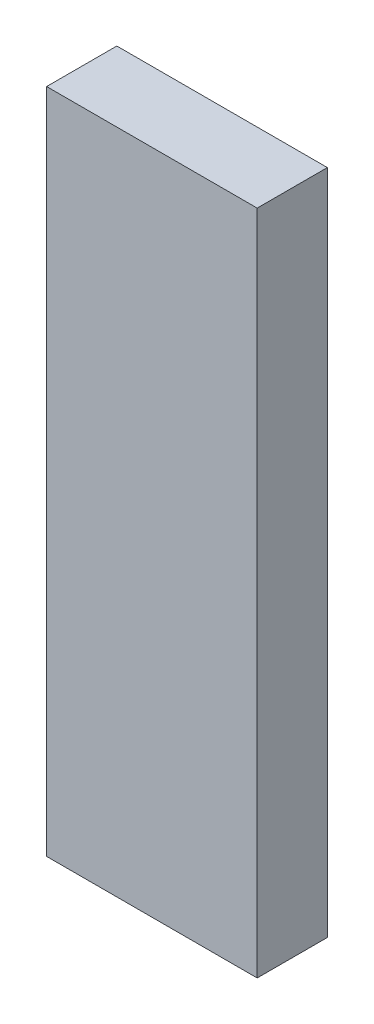
ISO-10303-21;
HEADER;
FILE_DESCRIPTION(('STEP AP214'),'2;1');
FILE_NAME('part.step','',(''),(''),'','','');
FILE_SCHEMA(('AUTOMOTIVE_DESIGN { 1 0 10303 214 1 1 1 1 }'));
ENDSEC;
DATA;
#1=APPLICATION_CONTEXT('core data for automotive mechanical design processes');
#2=APPLICATION_PROTOCOL_DEFINITION('international standard','automotive_design',2000,#1);
#3=PRODUCT_CONTEXT('',#1,'mechanical');
#4=PRODUCT('Part','Part','',(#3));
#5=PRODUCT_RELATED_PRODUCT_CATEGORY('part','',(#4));
#6=PRODUCT_DEFINITION_FORMATION('','',#4);
#7=PRODUCT_DEFINITION_CONTEXT('part definition',#1,'design');
#8=PRODUCT_DEFINITION('design','',#6,#7);
#9=PRODUCT_DEFINITION_SHAPE('','',#8);
#10=(LENGTH_UNIT() NAMED_UNIT(*) SI_UNIT(.MILLI.,.METRE.));
#11=(NAMED_UNIT(*) PLANE_ANGLE_UNIT() SI_UNIT($,.RADIAN.));
#12=(NAMED_UNIT(*) SI_UNIT($,.STERADIAN.) SOLID_ANGLE_UNIT());
#13=UNCERTAINTY_MEASURE_WITH_UNIT(LENGTH_MEASURE(1.E-05),#10,'distance_accuracy_value','');
#14=(GEOMETRIC_REPRESENTATION_CONTEXT(3) GLOBAL_UNCERTAINTY_ASSIGNED_CONTEXT((#13)) GLOBAL_UNIT_ASSIGNED_CONTEXT((#10,
#11,#12)) REPRESENTATION_CONTEXT('',''));
#15=CARTESIAN_POINT('',(0.,0.,0.));
#16=DIRECTION('',(0.,0.,1.));
#17=DIRECTION('',(1.,0.,0.));
#18=AXIS2_PLACEMENT_3D('',#15,#16,#17);
#19=CARTESIAN_POINT('',(-0.6,2.3,0.));
#20=DIRECTION('',(0.,0.,1.));
#21=DIRECTION('',(1.,0.,0.));
#22=AXIS2_PLACEMENT_3D('',#19,#20,#21);
#23=PLANE('',#22);
#24=DIRECTION('',(1.,0.,0.));
#25=VECTOR('',#24,1.);
#26=CARTESIAN_POINT('',(-0.6,0.4,0.));
#27=LINE('',#26,#25);
#28=CARTESIAN_POINT('',(0.,0.4,0.));
#29=VERTEX_POINT('',#28);
#30=CARTESIAN_POINT('',(-0.6,0.4,0.));
#31=VERTEX_POINT('',#30);
#32=EDGE_CURVE('E20',#29,#31,#27,.F.);
#33=ORIENTED_EDGE('',*,*,#32,.T.);
#34=DIRECTION('',(0.,1.,0.));
#35=VECTOR('',#34,1.);
#36=CARTESIAN_POINT('',(-0.6,2.3,0.));
#37=LINE('',#36,#35);
#38=CARTESIAN_POINT('',(-0.6,2.3,0.));
#39=VERTEX_POINT('',#38);
#40=EDGE_CURVE('E79',#31,#39,#37,.T.);
#41=ORIENTED_EDGE('',*,*,#40,.T.);
#42=DIRECTION('',(1.,0.,0.));
#43=VECTOR('',#42,1.);
#44=CARTESIAN_POINT('',(0.,2.3,0.));
#45=LINE('',#44,#43);
#46=CARTESIAN_POINT('',(0.,2.3,0.));
#47=VERTEX_POINT('',#46);
#48=EDGE_CURVE('E55',#39,#47,#45,.T.);
#49=ORIENTED_EDGE('',*,*,#48,.T.);
#50=DIRECTION('',(0.,-1.,0.));
#51=VECTOR('',#50,1.);
#52=CARTESIAN_POINT('',(0.,0.4,0.));
#53=LINE('',#52,#51);
#54=EDGE_CURVE('E57',#47,#29,#53,.T.);
#55=ORIENTED_EDGE('',*,*,#54,.T.);
#56=EDGE_LOOP('',(#33,#41,#49,#55));
#57=FACE_BOUND('',#56,.T.);
#58=ADVANCED_FACE('F17',(#57),#23,.F.);
#59=CARTESIAN_POINT('',(-0.6,0.4,0.2));
#60=DIRECTION('',(0.,1.,0.));
#61=DIRECTION('',(0.,0.,1.));
#62=AXIS2_PLACEMENT_3D('',#59,#60,#61);
#63=PLANE('',#62);
#64=DIRECTION('',(1.,0.,0.));
#65=VECTOR('',#64,1.);
#66=CARTESIAN_POINT('',(-0.6,0.4,0.2));
#67=LINE('',#66,#65);
#68=CARTESIAN_POINT('',(-0.6,0.4,0.2));
#69=VERTEX_POINT('',#68);
#70=CARTESIAN_POINT('',(0.,0.4,0.2));
#71=VERTEX_POINT('',#70);
#72=EDGE_CURVE('E83',#69,#71,#67,.T.);
#73=ORIENTED_EDGE('',*,*,#72,.F.);
#74=DIRECTION('',(0.,0.,-1.));
#75=VECTOR('',#74,1.);
#76=CARTESIAN_POINT('',(-0.6,0.4,0.2));
#77=LINE('',#76,#75);
#78=EDGE_CURVE('E68',#69,#31,#77,.T.);
#79=ORIENTED_EDGE('',*,*,#78,.T.);
#80=ORIENTED_EDGE('',*,*,#32,.F.);
#81=DIRECTION('',(0.,0.,1.));
#82=VECTOR('',#81,1.);
#83=CARTESIAN_POINT('',(0.,0.4,0.2));
#84=LINE('',#83,#82);
#85=EDGE_CURVE('E63',#29,#71,#84,.T.);
#86=ORIENTED_EDGE('',*,*,#85,.T.);
#87=EDGE_LOOP('',(#73,#79,#80,#86));
#88=FACE_BOUND('',#87,.T.);
#89=ADVANCED_FACE('F65',(#88),#63,.F.);
#90=CARTESIAN_POINT('',(0.,0.4,0.2));
#91=DIRECTION('',(-1.,0.,0.));
#92=DIRECTION('',(0.,-1.,0.));
#93=AXIS2_PLACEMENT_3D('',#90,#91,#92);
#94=PLANE('',#93);
#95=DIRECTION('',(0.,1.,0.));
#96=VECTOR('',#95,1.);
#97=CARTESIAN_POINT('',(0.,2.3,0.2));
#98=LINE('',#97,#96);
#99=CARTESIAN_POINT('',(0.,2.3,0.2));
#100=VERTEX_POINT('',#99);
#101=EDGE_CURVE('E72',#71,#100,#98,.T.);
#102=ORIENTED_EDGE('',*,*,#101,.F.);
#103=ORIENTED_EDGE('',*,*,#85,.F.);
#104=ORIENTED_EDGE('',*,*,#54,.F.);
#105=DIRECTION('',(0.,0.,-1.));
#106=VECTOR('',#105,1.);
#107=CARTESIAN_POINT('',(0.,2.3,0.2));
#108=LINE('',#107,#106);
#109=EDGE_CURVE('E75',#47,#100,#108,.F.);
#110=ORIENTED_EDGE('',*,*,#109,.T.);
#111=EDGE_LOOP('',(#102,#103,#104,#110));
#112=FACE_BOUND('',#111,.T.);
#113=ADVANCED_FACE('F70',(#112),#94,.F.);
#114=CARTESIAN_POINT('',(0.,2.3,0.2));
#115=DIRECTION('',(0.,-1.,0.));
#116=DIRECTION('',(0.,0.,-1.));
#117=AXIS2_PLACEMENT_3D('',#114,#115,#116);
#118=PLANE('',#117);
#119=DIRECTION('',(1.,0.,0.));
#120=VECTOR('',#119,1.);
#121=CARTESIAN_POINT('',(-0.6,2.3,0.2));
#122=LINE('',#121,#120);
#123=CARTESIAN_POINT('',(-0.6,2.3,0.2));
#124=VERTEX_POINT('',#123);
#125=EDGE_CURVE('E26',#100,#124,#122,.F.);
#126=ORIENTED_EDGE('',*,*,#125,.F.);
#127=ORIENTED_EDGE('',*,*,#109,.F.);
#128=ORIENTED_EDGE('',*,*,#48,.F.);
#129=DIRECTION('',(0.,0.,-1.));
#130=VECTOR('',#129,1.);
#131=CARTESIAN_POINT('',(-0.6,2.3,0.2));
#132=LINE('',#131,#130);
#133=EDGE_CURVE('E35',#39,#124,#132,.F.);
#134=ORIENTED_EDGE('',*,*,#133,.T.);
#135=EDGE_LOOP('',(#126,#127,#128,#134));
#136=FACE_BOUND('',#135,.T.);
#137=ADVANCED_FACE('F89',(#136),#118,.F.);
#138=CARTESIAN_POINT('',(-0.6,2.3,0.2));
#139=DIRECTION('',(1.,0.,0.));
#140=DIRECTION('',(0.,0.,-1.));
#141=AXIS2_PLACEMENT_3D('',#138,#139,#140);
#142=PLANE('',#141);
#143=DIRECTION('',(0.,1.,0.));
#144=VECTOR('',#143,1.);
#145=CARTESIAN_POINT('',(-0.6,2.3,0.2));
#146=LINE('',#145,#144);
#147=EDGE_CURVE('E11',#124,#69,#146,.F.);
#148=ORIENTED_EDGE('',*,*,#147,.F.);
#149=ORIENTED_EDGE('',*,*,#133,.F.);
#150=ORIENTED_EDGE('',*,*,#40,.F.);
#151=ORIENTED_EDGE('',*,*,#78,.F.);
#152=EDGE_LOOP('',(#148,#149,#150,#151));
#153=FACE_BOUND('',#152,.T.);
#154=ADVANCED_FACE('F91',(#153),#142,.F.);
#155=CARTESIAN_POINT('',(-0.6,2.3,0.2));
#156=DIRECTION('',(0.,0.,1.));
#157=DIRECTION('',(1.,0.,0.));
#158=AXIS2_PLACEMENT_3D('',#155,#156,#157);
#159=PLANE('',#158);
#160=ORIENTED_EDGE('',*,*,#125,.T.);
#161=ORIENTED_EDGE('',*,*,#147,.T.);
#162=ORIENTED_EDGE('',*,*,#72,.T.);
#163=ORIENTED_EDGE('',*,*,#101,.T.);
#164=EDGE_LOOP('',(#160,#161,#162,#163));
#165=FACE_BOUND('',#164,.T.);
#166=ADVANCED_FACE('F88',(#165),#159,.T.);
#167=CLOSED_SHELL('',(#58,#89,#113,#137,#154,#166));
#168=MANIFOLD_SOLID_BREP('B1',#167);
#169=ADVANCED_BREP_SHAPE_REPRESENTATION('',(#18,#168),#14);
#170=SHAPE_DEFINITION_REPRESENTATION(#9,#169);
ENDSEC;
END-ISO-10303-21;
